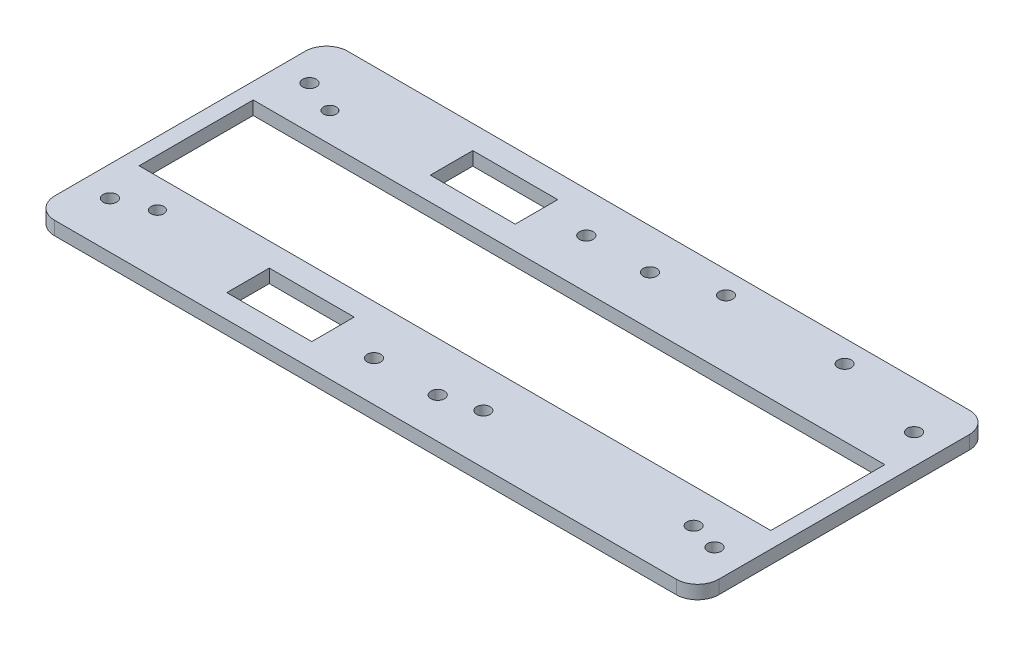
ISO-10303-21;
HEADER;
FILE_DESCRIPTION(('STEP AP214'),'2;1');
FILE_NAME('part.step','',(''),(''),'','','');
FILE_SCHEMA(('AUTOMOTIVE_DESIGN { 1 0 10303 214 1 1 1 1 }'));
ENDSEC;
DATA;
#1=APPLICATION_CONTEXT('core data for automotive mechanical design processes');
#2=APPLICATION_PROTOCOL_DEFINITION('international standard','automotive_design',2000,#1);
#3=PRODUCT_CONTEXT('',#1,'mechanical');
#4=PRODUCT('Part','Part','',(#3));
#5=PRODUCT_RELATED_PRODUCT_CATEGORY('part','',(#4));
#6=PRODUCT_DEFINITION_FORMATION('','',#4);
#7=PRODUCT_DEFINITION_CONTEXT('part definition',#1,'design');
#8=PRODUCT_DEFINITION('design','',#6,#7);
#9=PRODUCT_DEFINITION_SHAPE('','',#8);
#10=(LENGTH_UNIT() NAMED_UNIT(*) SI_UNIT(.MILLI.,.METRE.));
#11=(NAMED_UNIT(*) PLANE_ANGLE_UNIT() SI_UNIT($,.RADIAN.));
#12=(NAMED_UNIT(*) SI_UNIT($,.STERADIAN.) SOLID_ANGLE_UNIT());
#13=UNCERTAINTY_MEASURE_WITH_UNIT(LENGTH_MEASURE(1.E-05),#10,'distance_accuracy_value','');
#14=(GEOMETRIC_REPRESENTATION_CONTEXT(3) GLOBAL_UNCERTAINTY_ASSIGNED_CONTEXT((#13)) GLOBAL_UNIT_ASSIGNED_CONTEXT((#10,
#11,#12)) REPRESENTATION_CONTEXT('',''));
#15=CARTESIAN_POINT('',(0.,0.,0.));
#16=DIRECTION('',(0.,0.,1.));
#17=DIRECTION('',(1.,0.,0.));
#18=AXIS2_PLACEMENT_3D('',#15,#16,#17);
#19=CARTESIAN_POINT('',(78.2,3.175,-34.5));
#20=DIRECTION('',(-1.,0.,0.));
#21=DIRECTION('',(0.,0.,1.));
#22=AXIS2_PLACEMENT_3D('',#19,#20,#21);
#23=PLANE('',#22);
#24=DIRECTION('',(0.,0.,-1.));
#25=VECTOR('',#24,1.);
#26=CARTESIAN_POINT('',(78.2,0.,-34.5));
#27=LINE('',#26,#25);
#28=CARTESIAN_POINT('',(78.2,0.,29.5));
#29=VERTEX_POINT('',#28);
#30=CARTESIAN_POINT('',(78.2,0.,-29.5));
#31=VERTEX_POINT('',#30);
#32=EDGE_CURVE('E361',#29,#31,#27,.T.);
#33=ORIENTED_EDGE('',*,*,#32,.T.);
#34=DIRECTION('',(0.,-1.,0.));
#35=VECTOR('',#34,1.);
#36=CARTESIAN_POINT('',(78.2,3.175,-29.5));
#37=LINE('',#36,#35);
#38=CARTESIAN_POINT('',(78.2,3.175,-29.5));
#39=VERTEX_POINT('',#38);
#40=EDGE_CURVE('E400',#31,#39,#37,.F.);
#41=ORIENTED_EDGE('',*,*,#40,.T.);
#42=DIRECTION('',(0.,0.,-1.));
#43=VECTOR('',#42,1.);
#44=CARTESIAN_POINT('',(78.2,3.175,-34.5));
#45=LINE('',#44,#43);
#46=CARTESIAN_POINT('',(78.2,3.175,29.5));
#47=VERTEX_POINT('',#46);
#48=EDGE_CURVE('E364',#47,#39,#45,.T.);
#49=ORIENTED_EDGE('',*,*,#48,.F.);
#50=DIRECTION('',(0.,-1.,0.));
#51=VECTOR('',#50,1.);
#52=CARTESIAN_POINT('',(78.2,3.175,29.5));
#53=LINE('',#52,#51);
#54=EDGE_CURVE('E397',#47,#29,#53,.T.);
#55=ORIENTED_EDGE('',*,*,#54,.T.);
#56=EDGE_LOOP('',(#33,#41,#49,#55));
#57=FACE_BOUND('',#56,.T.);
#58=ADVANCED_FACE('F33',(#57),#23,.F.);
#59=CARTESIAN_POINT('',(-78.2,3.175,-34.5));
#60=DIRECTION('',(0.,0.,1.));
#61=DIRECTION('',(1.,0.,0.));
#62=AXIS2_PLACEMENT_3D('',#59,#60,#61);
#63=PLANE('',#62);
#64=DIRECTION('',(-1.,0.,0.));
#65=VECTOR('',#64,1.);
#66=CARTESIAN_POINT('',(-78.2,3.175,-34.5));
#67=LINE('',#66,#65);
#68=CARTESIAN_POINT('',(73.2,3.175,-34.5));
#69=VERTEX_POINT('',#68);
#70=CARTESIAN_POINT('',(-73.2,3.175,-34.5));
#71=VERTEX_POINT('',#70);
#72=EDGE_CURVE('E367',#69,#71,#67,.T.);
#73=ORIENTED_EDGE('',*,*,#72,.F.);
#74=DIRECTION('',(0.,-1.,0.));
#75=VECTOR('',#74,1.);
#76=CARTESIAN_POINT('',(73.2,3.175,-34.5));
#77=LINE('',#76,#75);
#78=CARTESIAN_POINT('',(73.2,0.,-34.5));
#79=VERTEX_POINT('',#78);
#80=EDGE_CURVE('E386',#69,#79,#77,.T.);
#81=ORIENTED_EDGE('',*,*,#80,.T.);
#82=DIRECTION('',(-1.,0.,0.));
#83=VECTOR('',#82,1.);
#84=CARTESIAN_POINT('',(-78.2,0.,-34.5));
#85=LINE('',#84,#83);
#86=CARTESIAN_POINT('',(-73.2,0.,-34.5));
#87=VERTEX_POINT('',#86);
#88=EDGE_CURVE('E378',#79,#87,#85,.T.);
#89=ORIENTED_EDGE('',*,*,#88,.T.);
#90=DIRECTION('',(0.,-1.,0.));
#91=VECTOR('',#90,1.);
#92=CARTESIAN_POINT('',(-73.2,3.175,-34.5));
#93=LINE('',#92,#91);
#94=EDGE_CURVE('E375',#87,#71,#93,.F.);
#95=ORIENTED_EDGE('',*,*,#94,.T.);
#96=EDGE_LOOP('',(#73,#81,#89,#95));
#97=FACE_BOUND('',#96,.T.);
#98=ADVANCED_FACE('F440',(#97),#63,.F.);
#99=CARTESIAN_POINT('',(-78.2,3.175,-34.5));
#100=DIRECTION('',(1.,0.,0.));
#101=DIRECTION('',(0.,0.,-1.));
#102=AXIS2_PLACEMENT_3D('',#99,#100,#101);
#103=PLANE('',#102);
#104=DIRECTION('',(0.,0.,1.));
#105=VECTOR('',#104,1.);
#106=CARTESIAN_POINT('',(-78.2,3.175,-34.5));
#107=LINE('',#106,#105);
#108=CARTESIAN_POINT('',(-78.2,3.175,-29.5));
#109=VERTEX_POINT('',#108);
#110=CARTESIAN_POINT('',(-78.2,3.175,29.5));
#111=VERTEX_POINT('',#110);
#112=EDGE_CURVE('E371',#109,#111,#107,.T.);
#113=ORIENTED_EDGE('',*,*,#112,.F.);
#114=DIRECTION('',(0.,-1.,0.));
#115=VECTOR('',#114,1.);
#116=CARTESIAN_POINT('',(-78.2,3.175,-29.5));
#117=LINE('',#116,#115);
#118=CARTESIAN_POINT('',(-78.2,0.,-29.5));
#119=VERTEX_POINT('',#118);
#120=EDGE_CURVE('E11',#109,#119,#117,.T.);
#121=ORIENTED_EDGE('',*,*,#120,.T.);
#122=DIRECTION('',(0.,0.,1.));
#123=VECTOR('',#122,1.);
#124=CARTESIAN_POINT('',(-78.2,0.,-34.5));
#125=LINE('',#124,#123);
#126=CARTESIAN_POINT('',(-78.2,0.,29.5));
#127=VERTEX_POINT('',#126);
#128=EDGE_CURVE('E381',#119,#127,#125,.T.);
#129=ORIENTED_EDGE('',*,*,#128,.T.);
#130=DIRECTION('',(0.,-1.,0.));
#131=VECTOR('',#130,1.);
#132=CARTESIAN_POINT('',(-78.2,3.175,29.5));
#133=LINE('',#132,#131);
#134=EDGE_CURVE('E41',#127,#111,#133,.F.);
#135=ORIENTED_EDGE('',*,*,#134,.T.);
#136=EDGE_LOOP('',(#113,#121,#129,#135));
#137=FACE_BOUND('',#136,.T.);
#138=ADVANCED_FACE('F415',(#137),#103,.F.);
#139=CARTESIAN_POINT('',(-78.2,3.175,34.5));
#140=DIRECTION('',(0.,0.,-1.));
#141=DIRECTION('',(-1.,0.,0.));
#142=AXIS2_PLACEMENT_3D('',#139,#140,#141);
#143=PLANE('',#142);
#144=DIRECTION('',(1.,0.,0.));
#145=VECTOR('',#144,1.);
#146=CARTESIAN_POINT('',(-78.2,0.,34.5));
#147=LINE('',#146,#145);
#148=CARTESIAN_POINT('',(-73.2,0.,34.5));
#149=VERTEX_POINT('',#148);
#150=CARTESIAN_POINT('',(73.2,0.,34.5));
#151=VERTEX_POINT('',#150);
#152=EDGE_CURVE('E368',#149,#151,#147,.T.);
#153=ORIENTED_EDGE('',*,*,#152,.T.);
#154=DIRECTION('',(0.,-1.,0.));
#155=VECTOR('',#154,1.);
#156=CARTESIAN_POINT('',(73.2,3.175,34.5));
#157=LINE('',#156,#155);
#158=CARTESIAN_POINT('',(73.2,3.175,34.5));
#159=VERTEX_POINT('',#158);
#160=EDGE_CURVE('E48',#151,#159,#157,.F.);
#161=ORIENTED_EDGE('',*,*,#160,.T.);
#162=DIRECTION('',(1.,0.,0.));
#163=VECTOR('',#162,1.);
#164=CARTESIAN_POINT('',(-78.2,3.175,34.5));
#165=LINE('',#164,#163);
#166=CARTESIAN_POINT('',(-73.2,3.175,34.5));
#167=VERTEX_POINT('',#166);
#168=EDGE_CURVE('E373',#167,#159,#165,.T.);
#169=ORIENTED_EDGE('',*,*,#168,.F.);
#170=DIRECTION('',(0.,-1.,0.));
#171=VECTOR('',#170,1.);
#172=CARTESIAN_POINT('',(-73.2,3.175,34.5));
#173=LINE('',#172,#171);
#174=EDGE_CURVE('E409',#167,#149,#173,.T.);
#175=ORIENTED_EDGE('',*,*,#174,.T.);
#176=EDGE_LOOP('',(#153,#161,#169,#175));
#177=FACE_BOUND('',#176,.T.);
#178=ADVANCED_FACE('F422',(#177),#143,.F.);
#179=CARTESIAN_POINT('',(0.,3.175,0.));
#180=DIRECTION('',(0.,1.,0.));
#181=DIRECTION('',(0.,0.,1.));
#182=AXIS2_PLACEMENT_3D('',#179,#180,#181);
#183=PLANE('',#182);
#184=DIRECTION('',(1.,0.,0.));
#185=VECTOR('',#184,1.);
#186=CARTESIAN_POINT('',(-38.2,3.175,18.965));
#187=LINE('',#186,#185);
#188=CARTESIAN_POINT('',(-38.2,3.175,18.965));
#189=VERTEX_POINT('',#188);
#190=CARTESIAN_POINT('',(-18.2,3.175,18.965));
#191=VERTEX_POINT('',#190);
#192=EDGE_CURVE('E176',#189,#191,#187,.T.);
#193=ORIENTED_EDGE('',*,*,#192,.T.);
#194=DIRECTION('',(0.,0.,1.));
#195=VECTOR('',#194,1.);
#196=CARTESIAN_POINT('',(-18.2,3.175,18.965));
#197=LINE('',#196,#195);
#198=CARTESIAN_POINT('',(-18.2,3.175,28.965));
#199=VERTEX_POINT('',#198);
#200=EDGE_CURVE('E188',#191,#199,#197,.T.);
#201=ORIENTED_EDGE('',*,*,#200,.T.);
#202=DIRECTION('',(-1.,0.,0.));
#203=VECTOR('',#202,1.);
#204=CARTESIAN_POINT('',(-38.2,3.175,28.965));
#205=LINE('',#204,#203);
#206=CARTESIAN_POINT('',(-38.2,3.175,28.965));
#207=VERTEX_POINT('',#206);
#208=EDGE_CURVE('E192',#199,#207,#205,.T.);
#209=ORIENTED_EDGE('',*,*,#208,.T.);
#210=DIRECTION('',(0.,0.,-1.));
#211=VECTOR('',#210,1.);
#212=CARTESIAN_POINT('',(-38.2,3.175,18.965));
#213=LINE('',#212,#211);
#214=EDGE_CURVE('E184',#207,#189,#213,.T.);
#215=ORIENTED_EDGE('',*,*,#214,.T.);
#216=EDGE_LOOP('',(#193,#201,#209,#215));
#217=FACE_BOUND('',#216,.T.);
#218=DIRECTION('',(0.,0.,1.));
#219=VECTOR('',#218,1.);
#220=CARTESIAN_POINT('',(-18.2,3.175,-18.965));
#221=LINE('',#220,#219);
#222=CARTESIAN_POINT('',(-18.2,3.175,-28.965));
#223=VERTEX_POINT('',#222);
#224=CARTESIAN_POINT('',(-18.2,3.175,-18.965));
#225=VERTEX_POINT('',#224);
#226=EDGE_CURVE('E216',#223,#225,#221,.T.);
#227=ORIENTED_EDGE('',*,*,#226,.T.);
#228=DIRECTION('',(-1.,0.,0.));
#229=VECTOR('',#228,1.);
#230=CARTESIAN_POINT('',(-38.2,3.175,-18.965));
#231=LINE('',#230,#229);
#232=CARTESIAN_POINT('',(-38.2,3.175,-18.965));
#233=VERTEX_POINT('',#232);
#234=EDGE_CURVE('E219',#225,#233,#231,.T.);
#235=ORIENTED_EDGE('',*,*,#234,.T.);
#236=DIRECTION('',(0.,0.,-1.));
#237=VECTOR('',#236,1.);
#238=CARTESIAN_POINT('',(-38.2,3.175,-18.965));
#239=LINE('',#238,#237);
#240=CARTESIAN_POINT('',(-38.2,3.175,-28.965));
#241=VERTEX_POINT('',#240);
#242=EDGE_CURVE('E223',#233,#241,#239,.T.);
#243=ORIENTED_EDGE('',*,*,#242,.T.);
#244=DIRECTION('',(1.,0.,0.));
#245=VECTOR('',#244,1.);
#246=CARTESIAN_POINT('',(-38.2,3.175,-28.965));
#247=LINE('',#246,#245);
#248=EDGE_CURVE('E226',#241,#223,#247,.T.);
#249=ORIENTED_EDGE('',*,*,#248,.T.);
#250=EDGE_LOOP('',(#227,#235,#243,#249));
#251=FACE_BOUND('',#250,.T.);
#252=DIRECTION('',(0.,0.,1.));
#253=VECTOR('',#252,1.);
#254=CARTESIAN_POINT('',(74.3900000000001,3.175,-13.43));
#255=LINE('',#254,#253);
#256=CARTESIAN_POINT('',(74.3900000000001,3.175,-13.43));
#257=VERTEX_POINT('',#256);
#258=CARTESIAN_POINT('',(74.3900000000001,3.175,13.43));
#259=VERTEX_POINT('',#258);
#260=EDGE_CURVE('E248',#257,#259,#255,.T.);
#261=ORIENTED_EDGE('',*,*,#260,.T.);
#262=DIRECTION('',(-1.,0.,0.));
#263=VECTOR('',#262,1.);
#264=CARTESIAN_POINT('',(74.3900000000001,3.175,13.43));
#265=LINE('',#264,#263);
#266=CARTESIAN_POINT('',(-74.3899999999999,3.175,13.43));
#267=VERTEX_POINT('',#266);
#268=EDGE_CURVE('E251',#259,#267,#265,.T.);
#269=ORIENTED_EDGE('',*,*,#268,.T.);
#270=DIRECTION('',(0.,0.,-1.));
#271=VECTOR('',#270,1.);
#272=CARTESIAN_POINT('',(-74.3899999999999,3.175,13.43));
#273=LINE('',#272,#271);
#274=CARTESIAN_POINT('',(-74.3899999999999,3.175,-13.43));
#275=VERTEX_POINT('',#274);
#276=EDGE_CURVE('E255',#267,#275,#273,.T.);
#277=ORIENTED_EDGE('',*,*,#276,.T.);
#278=DIRECTION('',(1.,0.,0.));
#279=VECTOR('',#278,1.);
#280=CARTESIAN_POINT('',(-74.3899999999999,3.175,-13.43));
#281=LINE('',#280,#279);
#282=EDGE_CURVE('E258',#275,#257,#281,.T.);
#283=ORIENTED_EDGE('',*,*,#282,.T.);
#284=EDGE_LOOP('',(#261,#269,#277,#283));
#285=FACE_BOUND('',#284,.T.);
#286=CARTESIAN_POINT('',(-7.5,3.175,-25.));
#287=DIRECTION('',(0.,1.,0.));
#288=DIRECTION('',(0.,0.,1.));
#289=AXIS2_PLACEMENT_3D('',#286,#287,#288);
#290=CIRCLE('',#289,1.6);
#291=CARTESIAN_POINT('',(-7.5,3.175,-23.4));
#292=VERTEX_POINT('',#291);
#293=EDGE_CURVE('E273',#292,#292,#290,.T.);
#294=ORIENTED_EDGE('',*,*,#293,.F.);
#295=EDGE_LOOP('',(#294));
#296=FACE_BOUND('',#295,.T.);
#297=CARTESIAN_POINT('',(7.5,3.175,-25.));
#298=DIRECTION('',(0.,1.,0.));
#299=DIRECTION('',(0.,0.,1.));
#300=AXIS2_PLACEMENT_3D('',#297,#298,#299);
#301=CIRCLE('',#300,1.6);
#302=CARTESIAN_POINT('',(7.5,3.175,-23.4));
#303=VERTEX_POINT('',#302);
#304=EDGE_CURVE('E283',#303,#303,#301,.T.);
#305=ORIENTED_EDGE('',*,*,#304,.F.);
#306=EDGE_LOOP('',(#305));
#307=FACE_BOUND('',#306,.T.);
#308=CARTESIAN_POINT('',(7.5,3.175,25.));
#309=DIRECTION('',(0.,1.,0.));
#310=DIRECTION('',(0.,0.,1.));
#311=AXIS2_PLACEMENT_3D('',#308,#309,#310);
#312=CIRCLE('',#311,1.6);
#313=CARTESIAN_POINT('',(7.5,3.175,26.6));
#314=VERTEX_POINT('',#313);
#315=EDGE_CURVE('E289',#314,#314,#312,.T.);
#316=ORIENTED_EDGE('',*,*,#315,.F.);
#317=EDGE_LOOP('',(#316));
#318=FACE_BOUND('',#317,.T.);
#319=CARTESIAN_POINT('',(-7.5,3.175,25.));
#320=DIRECTION('',(0.,1.,0.));
#321=DIRECTION('',(0.,0.,1.));
#322=AXIS2_PLACEMENT_3D('',#319,#320,#321);
#323=CIRCLE('',#322,1.6);
#324=CARTESIAN_POINT('',(-7.5,3.175,26.6));
#325=VERTEX_POINT('',#324);
#326=EDGE_CURVE('E295',#325,#325,#323,.T.);
#327=ORIENTED_EDGE('',*,*,#326,.F.);
#328=EDGE_LOOP('',(#327));
#329=FACE_BOUND('',#328,.T.);
#330=CARTESIAN_POINT('',(-63.2,3.175,-20.32));
#331=DIRECTION('',(0.,-1.,0.));
#332=DIRECTION('',(0.,0.,1.));
#333=AXIS2_PLACEMENT_3D('',#330,#331,#332);
#334=CIRCLE('',#333,1.5);
#335=CARTESIAN_POINT('',(-63.2,3.175,-18.82));
#336=VERTEX_POINT('',#335);
#337=EDGE_CURVE('E304',#336,#336,#334,.T.);
#338=ORIENTED_EDGE('',*,*,#337,.T.);
#339=EDGE_LOOP('',(#338));
#340=FACE_BOUND('',#339,.T.);
#341=CARTESIAN_POINT('',(-63.2,3.175,20.32));
#342=DIRECTION('',(0.,-1.,0.));
#343=DIRECTION('',(0.,0.,-1.));
#344=AXIS2_PLACEMENT_3D('',#341,#342,#343);
#345=CIRCLE('',#344,1.5);
#346=CARTESIAN_POINT('',(-63.2,3.175,18.82));
#347=VERTEX_POINT('',#346);
#348=EDGE_CURVE('E310',#347,#347,#345,.T.);
#349=ORIENTED_EDGE('',*,*,#348,.T.);
#350=EDGE_LOOP('',(#349));
#351=FACE_BOUND('',#350,.T.);
#352=CARTESIAN_POINT('',(16.07,3.175,22.8200000000006));
#353=DIRECTION('',(0.,-1.,0.));
#354=DIRECTION('',(0.,0.,-1.));
#355=AXIS2_PLACEMENT_3D('',#352,#353,#354);
#356=CIRCLE('',#355,1.5875);
#357=CARTESIAN_POINT('',(16.07,3.175,21.2325000000006));
#358=VERTEX_POINT('',#357);
#359=EDGE_CURVE('E316',#358,#358,#356,.T.);
#360=ORIENTED_EDGE('',*,*,#359,.T.);
#361=EDGE_LOOP('',(#360));
#362=FACE_BOUND('',#361,.T.);
#363=CARTESIAN_POINT('',(64.3299999999999,3.175,21.5499999999996));
#364=DIRECTION('',(0.,-1.,0.));
#365=DIRECTION('',(0.,0.,-1.));
#366=AXIS2_PLACEMENT_3D('',#363,#364,#365);
#367=CIRCLE('',#366,1.58749999999999);
#368=CARTESIAN_POINT('',(64.3299999999999,3.175,19.9624999999996));
#369=VERTEX_POINT('',#368);
#370=EDGE_CURVE('E322',#369,#369,#367,.T.);
#371=ORIENTED_EDGE('',*,*,#370,.T.);
#372=EDGE_LOOP('',(#371));
#373=FACE_BOUND('',#372,.T.);
#374=CARTESIAN_POINT('',(21.1499999999989,3.175,-29.2499999999995));
#375=DIRECTION('',(0.,-1.,0.));
#376=DIRECTION('',(0.,0.,-1.));
#377=AXIS2_PLACEMENT_3D('',#374,#375,#376);
#378=CIRCLE('',#377,1.58750000000001);
#379=CARTESIAN_POINT('',(21.1499999999989,3.175,-30.8374999999995));
#380=VERTEX_POINT('',#379);
#381=EDGE_CURVE('E328',#380,#380,#378,.T.);
#382=ORIENTED_EDGE('',*,*,#381,.T.);
#383=EDGE_LOOP('',(#382));
#384=FACE_BOUND('',#383,.T.);
#385=CARTESIAN_POINT('',(49.0899999999989,3.175,-29.2500000000001));
#386=DIRECTION('',(0.,-1.,0.));
#387=DIRECTION('',(0.,0.,-1.));
#388=AXIS2_PLACEMENT_3D('',#385,#386,#387);
#389=CIRCLE('',#388,1.58750000000001);
#390=CARTESIAN_POINT('',(49.0899999999989,3.175,-30.8375000000001));
#391=VERTEX_POINT('',#390);
#392=EDGE_CURVE('E334',#391,#391,#389,.T.);
#393=ORIENTED_EDGE('',*,*,#392,.T.);
#394=EDGE_LOOP('',(#393));
#395=FACE_BOUND('',#394,.T.);
#396=CARTESIAN_POINT('',(-71.2,3.175,23.5));
#397=DIRECTION('',(0.,1.,0.));
#398=DIRECTION('',(0.,0.,-1.));
#399=AXIS2_PLACEMENT_3D('',#396,#397,#398);
#400=CIRCLE('',#399,1.6);
#401=CARTESIAN_POINT('',(-71.2,3.175,21.9));
#402=VERTEX_POINT('',#401);
#403=EDGE_CURVE('E337',#402,#402,#400,.T.);
#404=ORIENTED_EDGE('',*,*,#403,.F.);
#405=EDGE_LOOP('',(#404));
#406=FACE_BOUND('',#405,.T.);
#407=CARTESIAN_POINT('',(-71.2,3.175,-23.5));
#408=DIRECTION('',(0.,1.,0.));
#409=DIRECTION('',(0.,0.,1.));
#410=AXIS2_PLACEMENT_3D('',#407,#408,#409);
#411=CIRCLE('',#410,1.6);
#412=CARTESIAN_POINT('',(-71.2,3.175,-21.9));
#413=VERTEX_POINT('',#412);
#414=EDGE_CURVE('E343',#413,#413,#411,.T.);
#415=ORIENTED_EDGE('',*,*,#414,.F.);
#416=EDGE_LOOP('',(#415));
#417=FACE_BOUND('',#416,.T.);
#418=CARTESIAN_POINT('',(71.2,3.175,-23.5));
#419=DIRECTION('',(0.,1.,0.));
#420=DIRECTION('',(0.,0.,-1.));
#421=AXIS2_PLACEMENT_3D('',#418,#419,#420);
#422=CIRCLE('',#421,1.6);
#423=CARTESIAN_POINT('',(71.2,3.175,-25.1));
#424=VERTEX_POINT('',#423);
#425=EDGE_CURVE('E349',#424,#424,#422,.T.);
#426=ORIENTED_EDGE('',*,*,#425,.F.);
#427=EDGE_LOOP('',(#426));
#428=FACE_BOUND('',#427,.T.);
#429=CARTESIAN_POINT('',(71.2,3.175,23.5));
#430=DIRECTION('',(0.,1.,0.));
#431=DIRECTION('',(0.,0.,1.));
#432=AXIS2_PLACEMENT_3D('',#429,#430,#431);
#433=CIRCLE('',#432,1.6);
#434=CARTESIAN_POINT('',(71.2,3.175,25.1));
#435=VERTEX_POINT('',#434);
#436=EDGE_CURVE('E355',#435,#435,#433,.T.);
#437=ORIENTED_EDGE('',*,*,#436,.F.);
#438=EDGE_LOOP('',(#437));
#439=FACE_BOUND('',#438,.T.);
#440=ORIENTED_EDGE('',*,*,#48,.T.);
#441=CARTESIAN_POINT('',(73.2,3.175,-29.5));
#442=DIRECTION('',(0.,1.,0.));
#443=DIRECTION('',(0.,0.,1.));
#444=AXIS2_PLACEMENT_3D('',#441,#442,#443);
#445=CIRCLE('',#444,5.);
#446=EDGE_CURVE('E407',#39,#69,#445,.T.);
#447=ORIENTED_EDGE('',*,*,#446,.T.);
#448=ORIENTED_EDGE('',*,*,#72,.T.);
#449=CARTESIAN_POINT('',(-73.2,3.175,-29.5));
#450=DIRECTION('',(0.,1.,0.));
#451=DIRECTION('',(0.,0.,1.));
#452=AXIS2_PLACEMENT_3D('',#449,#450,#451);
#453=CIRCLE('',#452,5.);
#454=EDGE_CURVE('E403',#71,#109,#453,.T.);
#455=ORIENTED_EDGE('',*,*,#454,.T.);
#456=ORIENTED_EDGE('',*,*,#112,.T.);
#457=CARTESIAN_POINT('',(-73.2,3.175,29.5));
#458=DIRECTION('',(0.,1.,0.));
#459=DIRECTION('',(0.,0.,1.));
#460=AXIS2_PLACEMENT_3D('',#457,#458,#459);
#461=CIRCLE('',#460,5.);
#462=EDGE_CURVE('E55',#111,#167,#461,.T.);
#463=ORIENTED_EDGE('',*,*,#462,.T.);
#464=ORIENTED_EDGE('',*,*,#168,.T.);
#465=CARTESIAN_POINT('',(73.2,3.175,29.5));
#466=DIRECTION('',(0.,1.,0.));
#467=DIRECTION('',(0.,0.,1.));
#468=AXIS2_PLACEMENT_3D('',#465,#466,#467);
#469=CIRCLE('',#468,5.);
#470=EDGE_CURVE('E405',#159,#47,#469,.T.);
#471=ORIENTED_EDGE('',*,*,#470,.T.);
#472=EDGE_LOOP('',(#440,#447,#448,#455,#456,#463,#464,#471));
#473=FACE_BOUND('',#472,.T.);
#474=ADVANCED_FACE('F194',(#217,#251,#285,#296,#307,#318,#329,#340,#351,#362,#373,#384,#395,
#406,#417,#428,#439,#473),#183,.T.);
#475=CARTESIAN_POINT('',(0.,0.,0.));
#476=DIRECTION('',(0.,1.,0.));
#477=DIRECTION('',(0.,0.,1.));
#478=AXIS2_PLACEMENT_3D('',#475,#476,#477);
#479=PLANE('',#478);
#480=DIRECTION('',(0.,0.,1.));
#481=VECTOR('',#480,1.);
#482=CARTESIAN_POINT('',(-18.2,0.,18.965));
#483=LINE('',#482,#481);
#484=CARTESIAN_POINT('',(-18.2,0.,18.965));
#485=VERTEX_POINT('',#484);
#486=CARTESIAN_POINT('',(-18.2,0.,28.965));
#487=VERTEX_POINT('',#486);
#488=EDGE_CURVE('E206',#485,#487,#483,.T.);
#489=ORIENTED_EDGE('',*,*,#488,.F.);
#490=DIRECTION('',(1.,0.,0.));
#491=VECTOR('',#490,1.);
#492=CARTESIAN_POINT('',(-38.2,0.,18.965));
#493=LINE('',#492,#491);
#494=CARTESIAN_POINT('',(-38.2,0.,18.965));
#495=VERTEX_POINT('',#494);
#496=EDGE_CURVE('E179',#495,#485,#493,.T.);
#497=ORIENTED_EDGE('',*,*,#496,.F.);
#498=DIRECTION('',(0.,0.,-1.));
#499=VECTOR('',#498,1.);
#500=CARTESIAN_POINT('',(-38.2,0.,18.965));
#501=LINE('',#500,#499);
#502=CARTESIAN_POINT('',(-38.2,0.,28.965));
#503=VERTEX_POINT('',#502);
#504=EDGE_CURVE('E197',#503,#495,#501,.T.);
#505=ORIENTED_EDGE('',*,*,#504,.F.);
#506=DIRECTION('',(-1.,0.,0.));
#507=VECTOR('',#506,1.);
#508=CARTESIAN_POINT('',(-38.2,0.,28.965));
#509=LINE('',#508,#507);
#510=EDGE_CURVE('E200',#487,#503,#509,.T.);
#511=ORIENTED_EDGE('',*,*,#510,.F.);
#512=EDGE_LOOP('',(#489,#497,#505,#511));
#513=FACE_BOUND('',#512,.T.);
#514=DIRECTION('',(-1.,0.,0.));
#515=VECTOR('',#514,1.);
#516=CARTESIAN_POINT('',(-38.2,0.,-18.965));
#517=LINE('',#516,#515);
#518=CARTESIAN_POINT('',(-18.2,0.,-18.965));
#519=VERTEX_POINT('',#518);
#520=CARTESIAN_POINT('',(-38.2,0.,-18.965));
#521=VERTEX_POINT('',#520);
#522=EDGE_CURVE('E231',#519,#521,#517,.T.);
#523=ORIENTED_EDGE('',*,*,#522,.F.);
#524=DIRECTION('',(0.,0.,1.));
#525=VECTOR('',#524,1.);
#526=CARTESIAN_POINT('',(-18.2,0.,-18.965));
#527=LINE('',#526,#525);
#528=CARTESIAN_POINT('',(-18.2,0.,-28.965));
#529=VERTEX_POINT('',#528);
#530=EDGE_CURVE('E212',#529,#519,#527,.T.);
#531=ORIENTED_EDGE('',*,*,#530,.F.);
#532=DIRECTION('',(1.,0.,0.));
#533=VECTOR('',#532,1.);
#534=CARTESIAN_POINT('',(-38.2,0.,-28.965));
#535=LINE('',#534,#533);
#536=CARTESIAN_POINT('',(-38.2,0.,-28.965));
#537=VERTEX_POINT('',#536);
#538=EDGE_CURVE('E220',#537,#529,#535,.T.);
#539=ORIENTED_EDGE('',*,*,#538,.F.);
#540=DIRECTION('',(0.,0.,-1.));
#541=VECTOR('',#540,1.);
#542=CARTESIAN_POINT('',(-38.2,0.,-18.965));
#543=LINE('',#542,#541);
#544=EDGE_CURVE('E234',#521,#537,#543,.T.);
#545=ORIENTED_EDGE('',*,*,#544,.F.);
#546=EDGE_LOOP('',(#523,#531,#539,#545));
#547=FACE_BOUND('',#546,.T.);
#548=DIRECTION('',(-1.,0.,0.));
#549=VECTOR('',#548,1.);
#550=CARTESIAN_POINT('',(74.3900000000001,0.,13.43));
#551=LINE('',#550,#549);
#552=CARTESIAN_POINT('',(74.3900000000001,0.,13.43));
#553=VERTEX_POINT('',#552);
#554=CARTESIAN_POINT('',(-74.3899999999999,0.,13.43));
#555=VERTEX_POINT('',#554);
#556=EDGE_CURVE('E263',#553,#555,#551,.T.);
#557=ORIENTED_EDGE('',*,*,#556,.F.);
#558=DIRECTION('',(0.,0.,1.));
#559=VECTOR('',#558,1.);
#560=CARTESIAN_POINT('',(74.3900000000001,0.,-13.43));
#561=LINE('',#560,#559);
#562=CARTESIAN_POINT('',(74.3900000000001,0.,-13.43));
#563=VERTEX_POINT('',#562);
#564=EDGE_CURVE('E241',#563,#553,#561,.T.);
#565=ORIENTED_EDGE('',*,*,#564,.F.);
#566=DIRECTION('',(1.,0.,0.));
#567=VECTOR('',#566,1.);
#568=CARTESIAN_POINT('',(-74.3899999999999,0.,-13.43));
#569=LINE('',#568,#567);
#570=CARTESIAN_POINT('',(-74.3899999999999,0.,-13.43));
#571=VERTEX_POINT('',#570);
#572=EDGE_CURVE('E252',#571,#563,#569,.T.);
#573=ORIENTED_EDGE('',*,*,#572,.F.);
#574=DIRECTION('',(0.,0.,-1.));
#575=VECTOR('',#574,1.);
#576=CARTESIAN_POINT('',(-74.3899999999999,0.,13.43));
#577=LINE('',#576,#575);
#578=EDGE_CURVE('E266',#555,#571,#577,.T.);
#579=ORIENTED_EDGE('',*,*,#578,.F.);
#580=EDGE_LOOP('',(#557,#565,#573,#579));
#581=FACE_BOUND('',#580,.T.);
#582=CARTESIAN_POINT('',(-7.5,0.,-25.));
#583=DIRECTION('',(0.,1.,0.));
#584=DIRECTION('',(0.,0.,1.));
#585=AXIS2_PLACEMENT_3D('',#582,#583,#584);
#586=CIRCLE('',#585,1.6);
#587=CARTESIAN_POINT('',(-7.5,0.,-23.4));
#588=VERTEX_POINT('',#587);
#589=EDGE_CURVE('E280',#588,#588,#586,.T.);
#590=ORIENTED_EDGE('',*,*,#589,.T.);
#591=EDGE_LOOP('',(#590));
#592=FACE_BOUND('',#591,.T.);
#593=CARTESIAN_POINT('',(7.5,0.,-25.));
#594=DIRECTION('',(0.,1.,0.));
#595=DIRECTION('',(0.,0.,1.));
#596=AXIS2_PLACEMENT_3D('',#593,#594,#595);
#597=CIRCLE('',#596,1.6);
#598=CARTESIAN_POINT('',(7.5,0.,-23.4));
#599=VERTEX_POINT('',#598);
#600=EDGE_CURVE('E286',#599,#599,#597,.T.);
#601=ORIENTED_EDGE('',*,*,#600,.T.);
#602=EDGE_LOOP('',(#601));
#603=FACE_BOUND('',#602,.T.);
#604=CARTESIAN_POINT('',(7.5,0.,25.));
#605=DIRECTION('',(0.,1.,0.));
#606=DIRECTION('',(0.,0.,1.));
#607=AXIS2_PLACEMENT_3D('',#604,#605,#606);
#608=CIRCLE('',#607,1.6);
#609=CARTESIAN_POINT('',(7.5,0.,26.6));
#610=VERTEX_POINT('',#609);
#611=EDGE_CURVE('E292',#610,#610,#608,.T.);
#612=ORIENTED_EDGE('',*,*,#611,.T.);
#613=EDGE_LOOP('',(#612));
#614=FACE_BOUND('',#613,.T.);
#615=CARTESIAN_POINT('',(-7.5,0.,25.));
#616=DIRECTION('',(0.,1.,0.));
#617=DIRECTION('',(0.,0.,1.));
#618=AXIS2_PLACEMENT_3D('',#615,#616,#617);
#619=CIRCLE('',#618,1.6);
#620=CARTESIAN_POINT('',(-7.5,0.,26.6));
#621=VERTEX_POINT('',#620);
#622=EDGE_CURVE('E298',#621,#621,#619,.T.);
#623=ORIENTED_EDGE('',*,*,#622,.T.);
#624=EDGE_LOOP('',(#623));
#625=FACE_BOUND('',#624,.T.);
#626=CARTESIAN_POINT('',(-63.2,0.,-20.32));
#627=DIRECTION('',(0.,-1.,0.));
#628=DIRECTION('',(0.,0.,1.));
#629=AXIS2_PLACEMENT_3D('',#626,#627,#628);
#630=CIRCLE('',#629,1.5);
#631=CARTESIAN_POINT('',(-63.2,0.,-18.82));
#632=VERTEX_POINT('',#631);
#633=EDGE_CURVE('E301',#632,#632,#630,.T.);
#634=ORIENTED_EDGE('',*,*,#633,.F.);
#635=EDGE_LOOP('',(#634));
#636=FACE_BOUND('',#635,.T.);
#637=CARTESIAN_POINT('',(-63.2,0.,20.32));
#638=DIRECTION('',(0.,-1.,0.));
#639=DIRECTION('',(0.,0.,-1.));
#640=AXIS2_PLACEMENT_3D('',#637,#638,#639);
#641=CIRCLE('',#640,1.5);
#642=CARTESIAN_POINT('',(-63.2,0.,18.82));
#643=VERTEX_POINT('',#642);
#644=EDGE_CURVE('E307',#643,#643,#641,.T.);
#645=ORIENTED_EDGE('',*,*,#644,.F.);
#646=EDGE_LOOP('',(#645));
#647=FACE_BOUND('',#646,.T.);
#648=CARTESIAN_POINT('',(16.07,0.,22.8200000000006));
#649=DIRECTION('',(0.,-1.,0.));
#650=DIRECTION('',(0.,0.,-1.));
#651=AXIS2_PLACEMENT_3D('',#648,#649,#650);
#652=CIRCLE('',#651,1.5875);
#653=CARTESIAN_POINT('',(16.07,0.,21.2325000000006));
#654=VERTEX_POINT('',#653);
#655=EDGE_CURVE('E313',#654,#654,#652,.T.);
#656=ORIENTED_EDGE('',*,*,#655,.F.);
#657=EDGE_LOOP('',(#656));
#658=FACE_BOUND('',#657,.T.);
#659=CARTESIAN_POINT('',(64.3299999999999,0.,21.5499999999996));
#660=DIRECTION('',(0.,-1.,0.));
#661=DIRECTION('',(0.,0.,-1.));
#662=AXIS2_PLACEMENT_3D('',#659,#660,#661);
#663=CIRCLE('',#662,1.58749999999999);
#664=CARTESIAN_POINT('',(64.3299999999999,0.,19.9624999999996));
#665=VERTEX_POINT('',#664);
#666=EDGE_CURVE('E319',#665,#665,#663,.T.);
#667=ORIENTED_EDGE('',*,*,#666,.F.);
#668=EDGE_LOOP('',(#667));
#669=FACE_BOUND('',#668,.T.);
#670=CARTESIAN_POINT('',(21.1499999999989,0.,-29.2499999999995));
#671=DIRECTION('',(0.,-1.,0.));
#672=DIRECTION('',(0.,0.,-1.));
#673=AXIS2_PLACEMENT_3D('',#670,#671,#672);
#674=CIRCLE('',#673,1.58750000000001);
#675=CARTESIAN_POINT('',(21.1499999999989,0.,-30.8374999999995));
#676=VERTEX_POINT('',#675);
#677=EDGE_CURVE('E325',#676,#676,#674,.T.);
#678=ORIENTED_EDGE('',*,*,#677,.F.);
#679=EDGE_LOOP('',(#678));
#680=FACE_BOUND('',#679,.T.);
#681=CARTESIAN_POINT('',(49.0899999999989,0.,-29.2500000000001));
#682=DIRECTION('',(0.,-1.,0.));
#683=DIRECTION('',(0.,0.,-1.));
#684=AXIS2_PLACEMENT_3D('',#681,#682,#683);
#685=CIRCLE('',#684,1.58750000000001);
#686=CARTESIAN_POINT('',(49.0899999999989,0.,-30.8375000000001));
#687=VERTEX_POINT('',#686);
#688=EDGE_CURVE('E331',#687,#687,#685,.T.);
#689=ORIENTED_EDGE('',*,*,#688,.F.);
#690=EDGE_LOOP('',(#689));
#691=FACE_BOUND('',#690,.T.);
#692=CARTESIAN_POINT('',(-71.2,0.,23.5));
#693=DIRECTION('',(0.,1.,0.));
#694=DIRECTION('',(0.,0.,-1.));
#695=AXIS2_PLACEMENT_3D('',#692,#693,#694);
#696=CIRCLE('',#695,1.6);
#697=CARTESIAN_POINT('',(-71.2,0.,21.9));
#698=VERTEX_POINT('',#697);
#699=EDGE_CURVE('E340',#698,#698,#696,.T.);
#700=ORIENTED_EDGE('',*,*,#699,.T.);
#701=EDGE_LOOP('',(#700));
#702=FACE_BOUND('',#701,.T.);
#703=CARTESIAN_POINT('',(-71.2,0.,-23.5));
#704=DIRECTION('',(0.,1.,0.));
#705=DIRECTION('',(0.,0.,1.));
#706=AXIS2_PLACEMENT_3D('',#703,#704,#705);
#707=CIRCLE('',#706,1.6);
#708=CARTESIAN_POINT('',(-71.2,0.,-21.9));
#709=VERTEX_POINT('',#708);
#710=EDGE_CURVE('E346',#709,#709,#707,.T.);
#711=ORIENTED_EDGE('',*,*,#710,.T.);
#712=EDGE_LOOP('',(#711));
#713=FACE_BOUND('',#712,.T.);
#714=CARTESIAN_POINT('',(71.2,0.,-23.5));
#715=DIRECTION('',(0.,1.,0.));
#716=DIRECTION('',(0.,0.,-1.));
#717=AXIS2_PLACEMENT_3D('',#714,#715,#716);
#718=CIRCLE('',#717,1.6);
#719=CARTESIAN_POINT('',(71.2,0.,-25.1));
#720=VERTEX_POINT('',#719);
#721=EDGE_CURVE('E352',#720,#720,#718,.T.);
#722=ORIENTED_EDGE('',*,*,#721,.T.);
#723=EDGE_LOOP('',(#722));
#724=FACE_BOUND('',#723,.T.);
#725=CARTESIAN_POINT('',(71.2,0.,23.5));
#726=DIRECTION('',(0.,1.,0.));
#727=DIRECTION('',(0.,0.,1.));
#728=AXIS2_PLACEMENT_3D('',#725,#726,#727);
#729=CIRCLE('',#728,1.6);
#730=CARTESIAN_POINT('',(71.2,0.,25.1));
#731=VERTEX_POINT('',#730);
#732=EDGE_CURVE('E358',#731,#731,#729,.T.);
#733=ORIENTED_EDGE('',*,*,#732,.T.);
#734=EDGE_LOOP('',(#733));
#735=FACE_BOUND('',#734,.T.);
#736=ORIENTED_EDGE('',*,*,#88,.F.);
#737=CARTESIAN_POINT('',(73.2,0.,-29.5));
#738=DIRECTION('',(0.,1.,0.));
#739=DIRECTION('',(0.,0.,1.));
#740=AXIS2_PLACEMENT_3D('',#737,#738,#739);
#741=CIRCLE('',#740,5.);
#742=EDGE_CURVE('E395',#79,#31,#741,.F.);
#743=ORIENTED_EDGE('',*,*,#742,.T.);
#744=ORIENTED_EDGE('',*,*,#32,.F.);
#745=CARTESIAN_POINT('',(73.2,0.,29.5));
#746=DIRECTION('',(0.,1.,0.));
#747=DIRECTION('',(0.,0.,1.));
#748=AXIS2_PLACEMENT_3D('',#745,#746,#747);
#749=CIRCLE('',#748,5.);
#750=EDGE_CURVE('E393',#29,#151,#749,.F.);
#751=ORIENTED_EDGE('',*,*,#750,.T.);
#752=ORIENTED_EDGE('',*,*,#152,.F.);
#753=CARTESIAN_POINT('',(-73.2,0.,29.5));
#754=DIRECTION('',(0.,1.,0.));
#755=DIRECTION('',(0.,0.,1.));
#756=AXIS2_PLACEMENT_3D('',#753,#754,#755);
#757=CIRCLE('',#756,5.);
#758=EDGE_CURVE('E389',#149,#127,#757,.F.);
#759=ORIENTED_EDGE('',*,*,#758,.T.);
#760=ORIENTED_EDGE('',*,*,#128,.F.);
#761=CARTESIAN_POINT('',(-73.2,0.,-29.5));
#762=DIRECTION('',(0.,1.,0.));
#763=DIRECTION('',(0.,0.,1.));
#764=AXIS2_PLACEMENT_3D('',#761,#762,#763);
#765=CIRCLE('',#764,5.);
#766=EDGE_CURVE('E391',#119,#87,#765,.F.);
#767=ORIENTED_EDGE('',*,*,#766,.T.);
#768=EDGE_LOOP('',(#736,#743,#744,#751,#752,#759,#760,#767));
#769=FACE_BOUND('',#768,.T.);
#770=ADVANCED_FACE('F425',(#513,#547,#581,#592,#603,#614,#625,#636,#647,#658,#669,#680,#691,
#702,#713,#724,#735,#769),#479,.F.);
#771=CARTESIAN_POINT('',(71.2,0.,23.5));
#772=DIRECTION('',(0.,1.,0.));
#773=DIRECTION('',(0.,0.,1.));
#774=AXIS2_PLACEMENT_3D('',#771,#772,#773);
#775=CYLINDRICAL_SURFACE('',#774,1.6);
#776=ORIENTED_EDGE('',*,*,#732,.F.);
#777=EDGE_LOOP('',(#776));
#778=FACE_BOUND('',#777,.T.);
#779=ORIENTED_EDGE('',*,*,#436,.T.);
#780=EDGE_LOOP('',(#779));
#781=FACE_BOUND('',#780,.T.);
#782=ADVANCED_FACE('F557',(#778,#781),#775,.F.);
#783=CARTESIAN_POINT('',(71.2,0.,-23.5));
#784=DIRECTION('',(0.,1.,0.));
#785=DIRECTION('',(0.,0.,1.));
#786=AXIS2_PLACEMENT_3D('',#783,#784,#785);
#787=CYLINDRICAL_SURFACE('',#786,1.6);
#788=ORIENTED_EDGE('',*,*,#721,.F.);
#789=EDGE_LOOP('',(#788));
#790=FACE_BOUND('',#789,.T.);
#791=ORIENTED_EDGE('',*,*,#425,.T.);
#792=EDGE_LOOP('',(#791));
#793=FACE_BOUND('',#792,.T.);
#794=ADVANCED_FACE('F553',(#790,#793),#787,.F.);
#795=CARTESIAN_POINT('',(-71.2,0.,-23.5));
#796=DIRECTION('',(0.,1.,0.));
#797=DIRECTION('',(0.,0.,1.));
#798=AXIS2_PLACEMENT_3D('',#795,#796,#797);
#799=CYLINDRICAL_SURFACE('',#798,1.6);
#800=ORIENTED_EDGE('',*,*,#710,.F.);
#801=EDGE_LOOP('',(#800));
#802=FACE_BOUND('',#801,.T.);
#803=ORIENTED_EDGE('',*,*,#414,.T.);
#804=EDGE_LOOP('',(#803));
#805=FACE_BOUND('',#804,.T.);
#806=ADVANCED_FACE('F549',(#802,#805),#799,.F.);
#807=CARTESIAN_POINT('',(-71.2,0.,23.5));
#808=DIRECTION('',(0.,1.,0.));
#809=DIRECTION('',(0.,0.,1.));
#810=AXIS2_PLACEMENT_3D('',#807,#808,#809);
#811=CYLINDRICAL_SURFACE('',#810,1.6);
#812=ORIENTED_EDGE('',*,*,#699,.F.);
#813=EDGE_LOOP('',(#812));
#814=FACE_BOUND('',#813,.T.);
#815=ORIENTED_EDGE('',*,*,#403,.T.);
#816=EDGE_LOOP('',(#815));
#817=FACE_BOUND('',#816,.T.);
#818=ADVANCED_FACE('F545',(#814,#817),#811,.F.);
#819=CARTESIAN_POINT('',(49.0899999999989,3.175,-29.2500000000001));
#820=DIRECTION('',(0.,-1.,0.));
#821=DIRECTION('',(0.,0.,-1.));
#822=AXIS2_PLACEMENT_3D('',#819,#820,#821);
#823=CYLINDRICAL_SURFACE('',#822,1.58750000000001);
#824=ORIENTED_EDGE('',*,*,#392,.F.);
#825=EDGE_LOOP('',(#824));
#826=FACE_BOUND('',#825,.T.);
#827=ORIENTED_EDGE('',*,*,#688,.T.);
#828=EDGE_LOOP('',(#827));
#829=FACE_BOUND('',#828,.T.);
#830=ADVANCED_FACE('F541',(#826,#829),#823,.F.);
#831=CARTESIAN_POINT('',(21.1499999999989,3.175,-29.2499999999995));
#832=DIRECTION('',(0.,-1.,0.));
#833=DIRECTION('',(0.,0.,-1.));
#834=AXIS2_PLACEMENT_3D('',#831,#832,#833);
#835=CYLINDRICAL_SURFACE('',#834,1.58750000000001);
#836=ORIENTED_EDGE('',*,*,#381,.F.);
#837=EDGE_LOOP('',(#836));
#838=FACE_BOUND('',#837,.T.);
#839=ORIENTED_EDGE('',*,*,#677,.T.);
#840=EDGE_LOOP('',(#839));
#841=FACE_BOUND('',#840,.T.);
#842=ADVANCED_FACE('F537',(#838,#841),#835,.F.);
#843=CARTESIAN_POINT('',(64.3299999999999,3.175,21.5499999999996));
#844=DIRECTION('',(0.,-1.,0.));
#845=DIRECTION('',(0.,0.,-1.));
#846=AXIS2_PLACEMENT_3D('',#843,#844,#845);
#847=CYLINDRICAL_SURFACE('',#846,1.58749999999999);
#848=ORIENTED_EDGE('',*,*,#370,.F.);
#849=EDGE_LOOP('',(#848));
#850=FACE_BOUND('',#849,.T.);
#851=ORIENTED_EDGE('',*,*,#666,.T.);
#852=EDGE_LOOP('',(#851));
#853=FACE_BOUND('',#852,.T.);
#854=ADVANCED_FACE('F533',(#850,#853),#847,.F.);
#855=CARTESIAN_POINT('',(16.07,3.175,22.8200000000006));
#856=DIRECTION('',(0.,-1.,0.));
#857=DIRECTION('',(0.,0.,-1.));
#858=AXIS2_PLACEMENT_3D('',#855,#856,#857);
#859=CYLINDRICAL_SURFACE('',#858,1.5875);
#860=ORIENTED_EDGE('',*,*,#359,.F.);
#861=EDGE_LOOP('',(#860));
#862=FACE_BOUND('',#861,.T.);
#863=ORIENTED_EDGE('',*,*,#655,.T.);
#864=EDGE_LOOP('',(#863));
#865=FACE_BOUND('',#864,.T.);
#866=ADVANCED_FACE('F529',(#862,#865),#859,.F.);
#867=CARTESIAN_POINT('',(-63.2,3.175,20.32));
#868=DIRECTION('',(0.,-1.,0.));
#869=DIRECTION('',(0.,0.,-1.));
#870=AXIS2_PLACEMENT_3D('',#867,#868,#869);
#871=CYLINDRICAL_SURFACE('',#870,1.5);
#872=ORIENTED_EDGE('',*,*,#348,.F.);
#873=EDGE_LOOP('',(#872));
#874=FACE_BOUND('',#873,.T.);
#875=ORIENTED_EDGE('',*,*,#644,.T.);
#876=EDGE_LOOP('',(#875));
#877=FACE_BOUND('',#876,.T.);
#878=ADVANCED_FACE('F525',(#874,#877),#871,.F.);
#879=CARTESIAN_POINT('',(-63.2,3.175,-20.32));
#880=DIRECTION('',(0.,-1.,0.));
#881=DIRECTION('',(0.,0.,-1.));
#882=AXIS2_PLACEMENT_3D('',#879,#880,#881);
#883=CYLINDRICAL_SURFACE('',#882,1.5);
#884=ORIENTED_EDGE('',*,*,#337,.F.);
#885=EDGE_LOOP('',(#884));
#886=FACE_BOUND('',#885,.T.);
#887=ORIENTED_EDGE('',*,*,#633,.T.);
#888=EDGE_LOOP('',(#887));
#889=FACE_BOUND('',#888,.T.);
#890=ADVANCED_FACE('F521',(#886,#889),#883,.F.);
#891=CARTESIAN_POINT('',(-7.5,0.,25.));
#892=DIRECTION('',(0.,1.,0.));
#893=DIRECTION('',(0.,0.,1.));
#894=AXIS2_PLACEMENT_3D('',#891,#892,#893);
#895=CYLINDRICAL_SURFACE('',#894,1.6);
#896=ORIENTED_EDGE('',*,*,#622,.F.);
#897=EDGE_LOOP('',(#896));
#898=FACE_BOUND('',#897,.T.);
#899=ORIENTED_EDGE('',*,*,#326,.T.);
#900=EDGE_LOOP('',(#899));
#901=FACE_BOUND('',#900,.T.);
#902=ADVANCED_FACE('F517',(#898,#901),#895,.F.);
#903=CARTESIAN_POINT('',(7.5,0.,25.));
#904=DIRECTION('',(0.,1.,0.));
#905=DIRECTION('',(0.,0.,1.));
#906=AXIS2_PLACEMENT_3D('',#903,#904,#905);
#907=CYLINDRICAL_SURFACE('',#906,1.6);
#908=ORIENTED_EDGE('',*,*,#611,.F.);
#909=EDGE_LOOP('',(#908));
#910=FACE_BOUND('',#909,.T.);
#911=ORIENTED_EDGE('',*,*,#315,.T.);
#912=EDGE_LOOP('',(#911));
#913=FACE_BOUND('',#912,.T.);
#914=ADVANCED_FACE('F513',(#910,#913),#907,.F.);
#915=CARTESIAN_POINT('',(7.5,0.,-25.));
#916=DIRECTION('',(0.,1.,0.));
#917=DIRECTION('',(0.,0.,1.));
#918=AXIS2_PLACEMENT_3D('',#915,#916,#917);
#919=CYLINDRICAL_SURFACE('',#918,1.6);
#920=ORIENTED_EDGE('',*,*,#600,.F.);
#921=EDGE_LOOP('',(#920));
#922=FACE_BOUND('',#921,.T.);
#923=ORIENTED_EDGE('',*,*,#304,.T.);
#924=EDGE_LOOP('',(#923));
#925=FACE_BOUND('',#924,.T.);
#926=ADVANCED_FACE('F509',(#922,#925),#919,.F.);
#927=CARTESIAN_POINT('',(-7.5,0.,-25.));
#928=DIRECTION('',(0.,1.,0.));
#929=DIRECTION('',(0.,0.,1.));
#930=AXIS2_PLACEMENT_3D('',#927,#928,#929);
#931=CYLINDRICAL_SURFACE('',#930,1.6);
#932=ORIENTED_EDGE('',*,*,#589,.F.);
#933=EDGE_LOOP('',(#932));
#934=FACE_BOUND('',#933,.T.);
#935=ORIENTED_EDGE('',*,*,#293,.T.);
#936=EDGE_LOOP('',(#935));
#937=FACE_BOUND('',#936,.T.);
#938=ADVANCED_FACE('F505',(#934,#937),#931,.F.);
#939=CARTESIAN_POINT('',(74.3900000000001,3.175,-13.43));
#940=DIRECTION('',(1.,0.,0.));
#941=DIRECTION('',(0.,0.,-1.));
#942=AXIS2_PLACEMENT_3D('',#939,#940,#941);
#943=PLANE('',#942);
#944=ORIENTED_EDGE('',*,*,#564,.T.);
#945=DIRECTION('',(0.,-1.,0.));
#946=VECTOR('',#945,1.);
#947=CARTESIAN_POINT('',(74.3900000000001,3.175,13.43));
#948=LINE('',#947,#946);
#949=EDGE_CURVE('E261',#259,#553,#948,.T.);
#950=ORIENTED_EDGE('',*,*,#949,.F.);
#951=ORIENTED_EDGE('',*,*,#260,.F.);
#952=DIRECTION('',(0.,-1.,0.));
#953=VECTOR('',#952,1.);
#954=CARTESIAN_POINT('',(74.3900000000001,3.175,-13.43));
#955=LINE('',#954,#953);
#956=EDGE_CURVE('E271',#257,#563,#955,.T.);
#957=ORIENTED_EDGE('',*,*,#956,.T.);
#958=EDGE_LOOP('',(#944,#950,#951,#957));
#959=FACE_BOUND('',#958,.T.);
#960=ADVANCED_FACE('F495',(#959),#943,.F.);
#961=CARTESIAN_POINT('',(-74.3899999999999,3.175,-13.43));
#962=DIRECTION('',(0.,0.,-1.));
#963=DIRECTION('',(-1.,0.,0.));
#964=AXIS2_PLACEMENT_3D('',#961,#962,#963);
#965=PLANE('',#964);
#966=ORIENTED_EDGE('',*,*,#572,.T.);
#967=ORIENTED_EDGE('',*,*,#956,.F.);
#968=ORIENTED_EDGE('',*,*,#282,.F.);
#969=DIRECTION('',(0.,-1.,0.));
#970=VECTOR('',#969,1.);
#971=CARTESIAN_POINT('',(-74.3899999999999,3.175,-13.43));
#972=LINE('',#971,#970);
#973=EDGE_CURVE('E274',#275,#571,#972,.T.);
#974=ORIENTED_EDGE('',*,*,#973,.T.);
#975=EDGE_LOOP('',(#966,#967,#968,#974));
#976=FACE_BOUND('',#975,.T.);
#977=ADVANCED_FACE('F491',(#976),#965,.F.);
#978=CARTESIAN_POINT('',(-74.3899999999999,3.175,13.43));
#979=DIRECTION('',(-1.,0.,0.));
#980=DIRECTION('',(0.,0.,1.));
#981=AXIS2_PLACEMENT_3D('',#978,#979,#980);
#982=PLANE('',#981);
#983=ORIENTED_EDGE('',*,*,#578,.T.);
#984=ORIENTED_EDGE('',*,*,#973,.F.);
#985=ORIENTED_EDGE('',*,*,#276,.F.);
#986=DIRECTION('',(0.,-1.,0.));
#987=VECTOR('',#986,1.);
#988=CARTESIAN_POINT('',(-74.3899999999999,3.175,13.43));
#989=LINE('',#988,#987);
#990=EDGE_CURVE('E276',#267,#555,#989,.T.);
#991=ORIENTED_EDGE('',*,*,#990,.T.);
#992=EDGE_LOOP('',(#983,#984,#985,#991));
#993=FACE_BOUND('',#992,.T.);
#994=ADVANCED_FACE('F494',(#993),#982,.F.);
#995=CARTESIAN_POINT('',(74.3900000000001,3.175,13.43));
#996=DIRECTION('',(0.,0.,1.));
#997=DIRECTION('',(1.,0.,0.));
#998=AXIS2_PLACEMENT_3D('',#995,#996,#997);
#999=PLANE('',#998);
#1000=ORIENTED_EDGE('',*,*,#556,.T.);
#1001=ORIENTED_EDGE('',*,*,#990,.F.);
#1002=ORIENTED_EDGE('',*,*,#268,.F.);
#1003=ORIENTED_EDGE('',*,*,#949,.T.);
#1004=EDGE_LOOP('',(#1000,#1001,#1002,#1003));
#1005=FACE_BOUND('',#1004,.T.);
#1006=ADVANCED_FACE('F489',(#1005),#999,.F.);
#1007=CARTESIAN_POINT('',(-18.2,3.175,-18.965));
#1008=DIRECTION('',(1.,0.,0.));
#1009=DIRECTION('',(0.,0.,-1.));
#1010=AXIS2_PLACEMENT_3D('',#1007,#1008,#1009);
#1011=PLANE('',#1010);
#1012=ORIENTED_EDGE('',*,*,#530,.T.);
#1013=DIRECTION('',(0.,-1.,0.));
#1014=VECTOR('',#1013,1.);
#1015=CARTESIAN_POINT('',(-18.2,3.175,-18.965));
#1016=LINE('',#1015,#1014);
#1017=EDGE_CURVE('E229',#225,#519,#1016,.T.);
#1018=ORIENTED_EDGE('',*,*,#1017,.F.);
#1019=ORIENTED_EDGE('',*,*,#226,.F.);
#1020=DIRECTION('',(0.,-1.,0.));
#1021=VECTOR('',#1020,1.);
#1022=CARTESIAN_POINT('',(-18.2,3.175,-28.965));
#1023=LINE('',#1022,#1021);
#1024=EDGE_CURVE('E239',#223,#529,#1023,.T.);
#1025=ORIENTED_EDGE('',*,*,#1024,.T.);
#1026=EDGE_LOOP('',(#1012,#1018,#1019,#1025));
#1027=FACE_BOUND('',#1026,.T.);
#1028=ADVANCED_FACE('F479',(#1027),#1011,.F.);
#1029=CARTESIAN_POINT('',(-38.2,3.175,-28.965));
#1030=DIRECTION('',(0.,0.,-1.));
#1031=DIRECTION('',(-1.,0.,0.));
#1032=AXIS2_PLACEMENT_3D('',#1029,#1030,#1031);
#1033=PLANE('',#1032);
#1034=ORIENTED_EDGE('',*,*,#538,.T.);
#1035=ORIENTED_EDGE('',*,*,#1024,.F.);
#1036=ORIENTED_EDGE('',*,*,#248,.F.);
#1037=DIRECTION('',(0.,-1.,0.));
#1038=VECTOR('',#1037,1.);
#1039=CARTESIAN_POINT('',(-38.2,3.175,-28.965));
#1040=LINE('',#1039,#1038);
#1041=EDGE_CURVE('E242',#241,#537,#1040,.T.);
#1042=ORIENTED_EDGE('',*,*,#1041,.T.);
#1043=EDGE_LOOP('',(#1034,#1035,#1036,#1042));
#1044=FACE_BOUND('',#1043,.T.);
#1045=ADVANCED_FACE('F475',(#1044),#1033,.F.);
#1046=CARTESIAN_POINT('',(-38.2,3.175,-18.965));
#1047=DIRECTION('',(-1.,0.,0.));
#1048=DIRECTION('',(0.,0.,1.));
#1049=AXIS2_PLACEMENT_3D('',#1046,#1047,#1048);
#1050=PLANE('',#1049);
#1051=ORIENTED_EDGE('',*,*,#544,.T.);
#1052=ORIENTED_EDGE('',*,*,#1041,.F.);
#1053=ORIENTED_EDGE('',*,*,#242,.F.);
#1054=DIRECTION('',(0.,-1.,0.));
#1055=VECTOR('',#1054,1.);
#1056=CARTESIAN_POINT('',(-38.2,3.175,-18.965));
#1057=LINE('',#1056,#1055);
#1058=EDGE_CURVE('E244',#233,#521,#1057,.T.);
#1059=ORIENTED_EDGE('',*,*,#1058,.T.);
#1060=EDGE_LOOP('',(#1051,#1052,#1053,#1059));
#1061=FACE_BOUND('',#1060,.T.);
#1062=ADVANCED_FACE('F478',(#1061),#1050,.F.);
#1063=CARTESIAN_POINT('',(-38.2,3.175,-18.965));
#1064=DIRECTION('',(0.,0.,1.));
#1065=DIRECTION('',(1.,0.,0.));
#1066=AXIS2_PLACEMENT_3D('',#1063,#1064,#1065);
#1067=PLANE('',#1066);
#1068=ORIENTED_EDGE('',*,*,#522,.T.);
#1069=ORIENTED_EDGE('',*,*,#1058,.F.);
#1070=ORIENTED_EDGE('',*,*,#234,.F.);
#1071=ORIENTED_EDGE('',*,*,#1017,.T.);
#1072=EDGE_LOOP('',(#1068,#1069,#1070,#1071));
#1073=FACE_BOUND('',#1072,.T.);
#1074=ADVANCED_FACE('F474',(#1073),#1067,.F.);
#1075=CARTESIAN_POINT('',(-38.2,3.175,18.965));
#1076=DIRECTION('',(0.,0.,-1.));
#1077=DIRECTION('',(-1.,0.,0.));
#1078=AXIS2_PLACEMENT_3D('',#1075,#1076,#1077);
#1079=PLANE('',#1078);
#1080=ORIENTED_EDGE('',*,*,#496,.T.);
#1081=DIRECTION('',(0.,-1.,0.));
#1082=VECTOR('',#1081,1.);
#1083=CARTESIAN_POINT('',(-18.2,3.175,18.965));
#1084=LINE('',#1083,#1082);
#1085=EDGE_CURVE('E172',#191,#485,#1084,.T.);
#1086=ORIENTED_EDGE('',*,*,#1085,.F.);
#1087=ORIENTED_EDGE('',*,*,#192,.F.);
#1088=DIRECTION('',(0.,-1.,0.));
#1089=VECTOR('',#1088,1.);
#1090=CARTESIAN_POINT('',(-38.2,3.175,18.965));
#1091=LINE('',#1090,#1089);
#1092=EDGE_CURVE('E210',#189,#495,#1091,.T.);
#1093=ORIENTED_EDGE('',*,*,#1092,.T.);
#1094=EDGE_LOOP('',(#1080,#1086,#1087,#1093));
#1095=FACE_BOUND('',#1094,.T.);
#1096=ADVANCED_FACE('F174',(#1095),#1079,.F.);
#1097=CARTESIAN_POINT('',(-38.2,3.175,18.965));
#1098=DIRECTION('',(-1.,0.,0.));
#1099=DIRECTION('',(0.,0.,1.));
#1100=AXIS2_PLACEMENT_3D('',#1097,#1098,#1099);
#1101=PLANE('',#1100);
#1102=ORIENTED_EDGE('',*,*,#504,.T.);
#1103=ORIENTED_EDGE('',*,*,#1092,.F.);
#1104=ORIENTED_EDGE('',*,*,#214,.F.);
#1105=DIRECTION('',(0.,-1.,0.));
#1106=VECTOR('',#1105,1.);
#1107=CARTESIAN_POINT('',(-38.2,3.175,28.965));
#1108=LINE('',#1107,#1106);
#1109=EDGE_CURVE('E213',#207,#503,#1108,.T.);
#1110=ORIENTED_EDGE('',*,*,#1109,.T.);
#1111=EDGE_LOOP('',(#1102,#1103,#1104,#1110));
#1112=FACE_BOUND('',#1111,.T.);
#1113=ADVANCED_FACE('F467',(#1112),#1101,.F.);
#1114=CARTESIAN_POINT('',(-38.2,3.175,28.965));
#1115=DIRECTION('',(0.,0.,1.));
#1116=DIRECTION('',(1.,0.,0.));
#1117=AXIS2_PLACEMENT_3D('',#1114,#1115,#1116);
#1118=PLANE('',#1117);
#1119=ORIENTED_EDGE('',*,*,#510,.T.);
#1120=ORIENTED_EDGE('',*,*,#1109,.F.);
#1121=ORIENTED_EDGE('',*,*,#208,.F.);
#1122=DIRECTION('',(0.,-1.,0.));
#1123=VECTOR('',#1122,1.);
#1124=CARTESIAN_POINT('',(-18.2,3.175,28.965));
#1125=LINE('',#1124,#1123);
#1126=EDGE_CURVE('E183',#199,#487,#1125,.T.);
#1127=ORIENTED_EDGE('',*,*,#1126,.T.);
#1128=EDGE_LOOP('',(#1119,#1120,#1121,#1127));
#1129=FACE_BOUND('',#1128,.T.);
#1130=ADVANCED_FACE('F463',(#1129),#1118,.F.);
#1131=CARTESIAN_POINT('',(-18.2,3.175,18.965));
#1132=DIRECTION('',(1.,0.,0.));
#1133=DIRECTION('',(0.,0.,-1.));
#1134=AXIS2_PLACEMENT_3D('',#1131,#1132,#1133);
#1135=PLANE('',#1134);
#1136=ORIENTED_EDGE('',*,*,#488,.T.);
#1137=ORIENTED_EDGE('',*,*,#1126,.F.);
#1138=ORIENTED_EDGE('',*,*,#200,.F.);
#1139=ORIENTED_EDGE('',*,*,#1085,.T.);
#1140=EDGE_LOOP('',(#1136,#1137,#1138,#1139));
#1141=FACE_BOUND('',#1140,.T.);
#1142=ADVANCED_FACE('F189',(#1141),#1135,.F.);
#1143=CARTESIAN_POINT('',(73.2,3.175,-29.5));
#1144=DIRECTION('',(0.,-1.,0.));
#1145=DIRECTION('',(0.,0.,-1.));
#1146=AXIS2_PLACEMENT_3D('',#1143,#1144,#1145);
#1147=CYLINDRICAL_SURFACE('',#1146,5.);
#1148=ORIENTED_EDGE('',*,*,#446,.F.);
#1149=ORIENTED_EDGE('',*,*,#40,.F.);
#1150=ORIENTED_EDGE('',*,*,#742,.F.);
#1151=ORIENTED_EDGE('',*,*,#80,.F.);
#1152=EDGE_LOOP('',(#1148,#1149,#1150,#1151));
#1153=FACE_BOUND('',#1152,.T.);
#1154=ADVANCED_FACE('F438',(#1153),#1147,.T.);
#1155=CARTESIAN_POINT('',(73.2,3.175,29.5));
#1156=DIRECTION('',(0.,-1.,0.));
#1157=DIRECTION('',(0.,0.,-1.));
#1158=AXIS2_PLACEMENT_3D('',#1155,#1156,#1157);
#1159=CYLINDRICAL_SURFACE('',#1158,5.);
#1160=ORIENTED_EDGE('',*,*,#470,.F.);
#1161=ORIENTED_EDGE('',*,*,#160,.F.);
#1162=ORIENTED_EDGE('',*,*,#750,.F.);
#1163=ORIENTED_EDGE('',*,*,#54,.F.);
#1164=EDGE_LOOP('',(#1160,#1161,#1162,#1163));
#1165=FACE_BOUND('',#1164,.T.);
#1166=ADVANCED_FACE('F430',(#1165),#1159,.T.);
#1167=CARTESIAN_POINT('',(-73.2,3.175,-29.5));
#1168=DIRECTION('',(0.,-1.,0.));
#1169=DIRECTION('',(0.,0.,-1.));
#1170=AXIS2_PLACEMENT_3D('',#1167,#1168,#1169);
#1171=CYLINDRICAL_SURFACE('',#1170,5.);
#1172=ORIENTED_EDGE('',*,*,#454,.F.);
#1173=ORIENTED_EDGE('',*,*,#94,.F.);
#1174=ORIENTED_EDGE('',*,*,#766,.F.);
#1175=ORIENTED_EDGE('',*,*,#120,.F.);
#1176=EDGE_LOOP('',(#1172,#1173,#1174,#1175));
#1177=FACE_BOUND('',#1176,.T.);
#1178=ADVANCED_FACE('F443',(#1177),#1171,.T.);
#1179=CARTESIAN_POINT('',(-73.2,3.175,29.5));
#1180=DIRECTION('',(0.,-1.,0.));
#1181=DIRECTION('',(0.,0.,-1.));
#1182=AXIS2_PLACEMENT_3D('',#1179,#1180,#1181);
#1183=CYLINDRICAL_SURFACE('',#1182,5.);
#1184=ORIENTED_EDGE('',*,*,#462,.F.);
#1185=ORIENTED_EDGE('',*,*,#134,.F.);
#1186=ORIENTED_EDGE('',*,*,#758,.F.);
#1187=ORIENTED_EDGE('',*,*,#174,.F.);
#1188=EDGE_LOOP('',(#1184,#1185,#1186,#1187));
#1189=FACE_BOUND('',#1188,.T.);
#1190=ADVANCED_FACE('F35',(#1189),#1183,.T.);
#1191=CLOSED_SHELL('',(#58,#98,#138,#178,#474,#770,#782,#794,#806,#818,#830,#842,#854,#866,#878,
#890,#902,#914,#926,#938,#960,#977,#994,#1006,#1028,#1045,#1062,#1074,#1096,#1113,#1130,#1142,
#1154,#1166,#1178,#1190));
#1192=MANIFOLD_SOLID_BREP('B2',#1191);
#1193=ADVANCED_BREP_SHAPE_REPRESENTATION('',(#18,#1192),#14);
#1194=SHAPE_DEFINITION_REPRESENTATION(#9,#1193);
ENDSEC;
END-ISO-10303-21;
